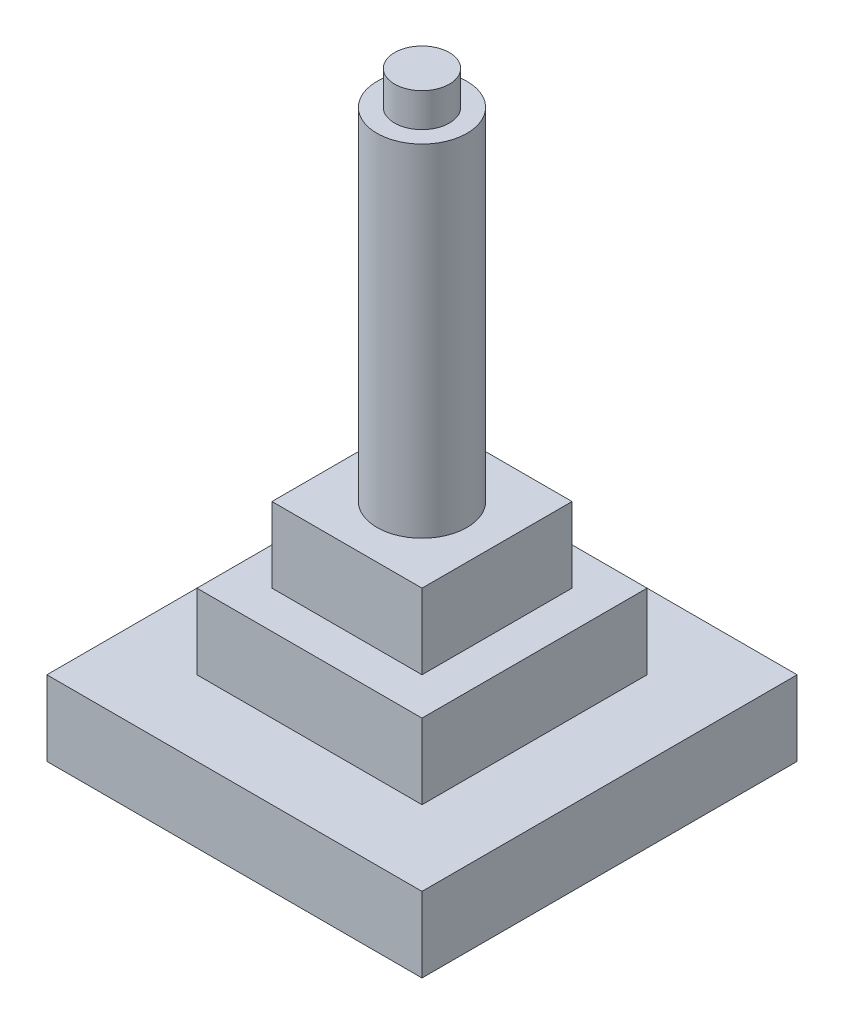
ISO-10303-21;
HEADER;
FILE_DESCRIPTION(('STEP AP214'),'2;1');
FILE_NAME('part.step','',(''),(''),'','','');
FILE_SCHEMA(('AUTOMOTIVE_DESIGN { 1 0 10303 214 1 1 1 1 }'));
ENDSEC;
DATA;
#1=APPLICATION_CONTEXT('core data for automotive mechanical design processes');
#2=APPLICATION_PROTOCOL_DEFINITION('international standard','automotive_design',2000,#1);
#3=PRODUCT_CONTEXT('',#1,'mechanical');
#4=PRODUCT('Part','Part','',(#3));
#5=PRODUCT_RELATED_PRODUCT_CATEGORY('part','',(#4));
#6=PRODUCT_DEFINITION_FORMATION('','',#4);
#7=PRODUCT_DEFINITION_CONTEXT('part definition',#1,'design');
#8=PRODUCT_DEFINITION('design','',#6,#7);
#9=PRODUCT_DEFINITION_SHAPE('','',#8);
#10=(LENGTH_UNIT() NAMED_UNIT(*) SI_UNIT(.MILLI.,.METRE.));
#11=(NAMED_UNIT(*) PLANE_ANGLE_UNIT() SI_UNIT($,.RADIAN.));
#12=(NAMED_UNIT(*) SI_UNIT($,.STERADIAN.) SOLID_ANGLE_UNIT());
#13=UNCERTAINTY_MEASURE_WITH_UNIT(LENGTH_MEASURE(1.E-05),#10,'distance_accuracy_value','');
#14=(GEOMETRIC_REPRESENTATION_CONTEXT(3) GLOBAL_UNCERTAINTY_ASSIGNED_CONTEXT((#13)) GLOBAL_UNIT_ASSIGNED_CONTEXT((#10,
#11,#12)) REPRESENTATION_CONTEXT('',''));
#15=CARTESIAN_POINT('',(0.,0.,0.));
#16=DIRECTION('',(0.,0.,1.));
#17=DIRECTION('',(1.,0.,0.));
#18=AXIS2_PLACEMENT_3D('',#15,#16,#17);
#19=CARTESIAN_POINT('',(0.,200.,0.));
#20=DIRECTION('',(0.,-1.,0.));
#21=DIRECTION('',(0.,0.,-1.));
#22=AXIS2_PLACEMENT_3D('',#19,#20,#21);
#23=PLANE('',#22);
#24=DIRECTION('',(0.,0.,-1.));
#25=VECTOR('',#24,1.);
#26=CARTESIAN_POINT('',(150.,200.,150.));
#27=LINE('',#26,#25);
#28=CARTESIAN_POINT('',(150.,200.,150.));
#29=VERTEX_POINT('',#28);
#30=CARTESIAN_POINT('',(150.,200.,-150.));
#31=VERTEX_POINT('',#30);
#32=EDGE_CURVE('E159',#29,#31,#27,.T.);
#33=ORIENTED_EDGE('',*,*,#32,.T.);
#34=DIRECTION('',(-1.,0.,0.));
#35=VECTOR('',#34,1.);
#36=CARTESIAN_POINT('',(-150.,200.,-150.));
#37=LINE('',#36,#35);
#38=CARTESIAN_POINT('',(-150.,200.,-150.));
#39=VERTEX_POINT('',#38);
#40=EDGE_CURVE('E162',#31,#39,#37,.T.);
#41=ORIENTED_EDGE('',*,*,#40,.T.);
#42=DIRECTION('',(0.,0.,1.));
#43=VECTOR('',#42,1.);
#44=CARTESIAN_POINT('',(-150.,200.,150.));
#45=LINE('',#44,#43);
#46=CARTESIAN_POINT('',(-150.,200.,150.));
#47=VERTEX_POINT('',#46);
#48=EDGE_CURVE('E165',#39,#47,#45,.T.);
#49=ORIENTED_EDGE('',*,*,#48,.T.);
#50=DIRECTION('',(1.,0.,0.));
#51=VECTOR('',#50,1.);
#52=CARTESIAN_POINT('',(-150.,200.,150.));
#53=LINE('',#52,#51);
#54=EDGE_CURVE('E167',#47,#29,#53,.T.);
#55=ORIENTED_EDGE('',*,*,#54,.T.);
#56=EDGE_LOOP('',(#33,#41,#49,#55));
#57=FACE_BOUND('',#56,.T.);
#58=DIRECTION('',(0.,0.,-1.));
#59=VECTOR('',#58,1.);
#60=CARTESIAN_POINT('',(100.,200.,100.));
#61=LINE('',#60,#59);
#62=CARTESIAN_POINT('',(100.,200.,100.));
#63=VERTEX_POINT('',#62);
#64=CARTESIAN_POINT('',(100.,200.,-100.));
#65=VERTEX_POINT('',#64);
#66=EDGE_CURVE('E56',#63,#65,#61,.T.);
#67=ORIENTED_EDGE('',*,*,#66,.F.);
#68=DIRECTION('',(1.,0.,0.));
#69=VECTOR('',#68,1.);
#70=CARTESIAN_POINT('',(-100.,200.,100.));
#71=LINE('',#70,#69);
#72=CARTESIAN_POINT('',(-100.,200.,100.));
#73=VERTEX_POINT('',#72);
#74=EDGE_CURVE('E60',#73,#63,#71,.T.);
#75=ORIENTED_EDGE('',*,*,#74,.F.);
#76=DIRECTION('',(0.,0.,1.));
#77=VECTOR('',#76,1.);
#78=CARTESIAN_POINT('',(-100.,200.,100.));
#79=LINE('',#78,#77);
#80=CARTESIAN_POINT('',(-100.,200.,-100.));
#81=VERTEX_POINT('',#80);
#82=EDGE_CURVE('E233',#81,#73,#79,.T.);
#83=ORIENTED_EDGE('',*,*,#82,.F.);
#84=DIRECTION('',(-1.,0.,0.));
#85=VECTOR('',#84,1.);
#86=CARTESIAN_POINT('',(-100.,200.,-100.));
#87=LINE('',#86,#85);
#88=EDGE_CURVE('E231',#65,#81,#87,.T.);
#89=ORIENTED_EDGE('',*,*,#88,.F.);
#90=EDGE_LOOP('',(#67,#75,#83,#89));
#91=FACE_BOUND('',#90,.T.);
#92=ADVANCED_FACE('F39',(#57,#91),#23,.F.);
#93=CARTESIAN_POINT('',(0.,100.,0.));
#94=DIRECTION('',(0.,-1.,0.));
#95=DIRECTION('',(0.,0.,-1.));
#96=AXIS2_PLACEMENT_3D('',#93,#94,#95);
#97=PLANE('',#96);
#98=DIRECTION('',(0.,0.,-1.));
#99=VECTOR('',#98,1.);
#100=CARTESIAN_POINT('',(250.,100.,250.));
#101=LINE('',#100,#99);
#102=CARTESIAN_POINT('',(250.,100.,250.));
#103=VERTEX_POINT('',#102);
#104=CARTESIAN_POINT('',(250.,100.,-250.));
#105=VERTEX_POINT('',#104);
#106=EDGE_CURVE('E189',#103,#105,#101,.T.);
#107=ORIENTED_EDGE('',*,*,#106,.T.);
#108=DIRECTION('',(-1.,0.,0.));
#109=VECTOR('',#108,1.);
#110=CARTESIAN_POINT('',(-250.,100.,-250.));
#111=LINE('',#110,#109);
#112=CARTESIAN_POINT('',(-250.,100.,-250.));
#113=VERTEX_POINT('',#112);
#114=EDGE_CURVE('E192',#105,#113,#111,.T.);
#115=ORIENTED_EDGE('',*,*,#114,.T.);
#116=DIRECTION('',(0.,0.,1.));
#117=VECTOR('',#116,1.);
#118=CARTESIAN_POINT('',(-250.,100.,250.));
#119=LINE('',#118,#117);
#120=CARTESIAN_POINT('',(-250.,100.,250.));
#121=VERTEX_POINT('',#120);
#122=EDGE_CURVE('E195',#113,#121,#119,.T.);
#123=ORIENTED_EDGE('',*,*,#122,.T.);
#124=DIRECTION('',(1.,0.,0.));
#125=VECTOR('',#124,1.);
#126=CARTESIAN_POINT('',(-250.,100.,250.));
#127=LINE('',#126,#125);
#128=EDGE_CURVE('E197',#121,#103,#127,.T.);
#129=ORIENTED_EDGE('',*,*,#128,.T.);
#130=EDGE_LOOP('',(#107,#115,#123,#129));
#131=FACE_BOUND('',#130,.T.);
#132=DIRECTION('',(0.,0.,-1.));
#133=VECTOR('',#132,1.);
#134=CARTESIAN_POINT('',(150.,100.,150.));
#135=LINE('',#134,#133);
#136=CARTESIAN_POINT('',(150.,100.,150.));
#137=VERTEX_POINT('',#136);
#138=CARTESIAN_POINT('',(150.,100.,-150.));
#139=VERTEX_POINT('',#138);
#140=EDGE_CURVE('E150',#137,#139,#135,.T.);
#141=ORIENTED_EDGE('',*,*,#140,.F.);
#142=DIRECTION('',(1.,0.,0.));
#143=VECTOR('',#142,1.);
#144=CARTESIAN_POINT('',(-150.,100.,150.));
#145=LINE('',#144,#143);
#146=CARTESIAN_POINT('',(-150.,100.,150.));
#147=VERTEX_POINT('',#146);
#148=EDGE_CURVE('E163',#147,#137,#145,.T.);
#149=ORIENTED_EDGE('',*,*,#148,.F.);
#150=DIRECTION('',(0.,0.,1.));
#151=VECTOR('',#150,1.);
#152=CARTESIAN_POINT('',(-150.,100.,150.));
#153=LINE('',#152,#151);
#154=CARTESIAN_POINT('',(-150.,100.,-150.));
#155=VERTEX_POINT('',#154);
#156=EDGE_CURVE('E172',#155,#147,#153,.T.);
#157=ORIENTED_EDGE('',*,*,#156,.F.);
#158=DIRECTION('',(-1.,0.,0.));
#159=VECTOR('',#158,1.);
#160=CARTESIAN_POINT('',(-150.,100.,-150.));
#161=LINE('',#160,#159);
#162=EDGE_CURVE('E153',#139,#155,#161,.T.);
#163=ORIENTED_EDGE('',*,*,#162,.F.);
#164=EDGE_LOOP('',(#141,#149,#157,#163));
#165=FACE_BOUND('',#164,.T.);
#166=ADVANCED_FACE('F243',(#131,#165),#97,.F.);
#167=CARTESIAN_POINT('',(250.,100.,250.));
#168=DIRECTION('',(-1.,0.,0.));
#169=DIRECTION('',(0.,0.,1.));
#170=AXIS2_PLACEMENT_3D('',#167,#168,#169);
#171=PLANE('',#170);
#172=DIRECTION('',(0.,0.,-1.));
#173=VECTOR('',#172,1.);
#174=CARTESIAN_POINT('',(250.,0.,250.));
#175=LINE('',#174,#173);
#176=CARTESIAN_POINT('',(250.,0.,250.));
#177=VERTEX_POINT('',#176);
#178=CARTESIAN_POINT('',(250.,0.,-250.));
#179=VERTEX_POINT('',#178);
#180=EDGE_CURVE('E188',#177,#179,#175,.T.);
#181=ORIENTED_EDGE('',*,*,#180,.T.);
#182=DIRECTION('',(0.,-1.,0.));
#183=VECTOR('',#182,1.);
#184=CARTESIAN_POINT('',(250.,100.,-250.));
#185=LINE('',#184,#183);
#186=EDGE_CURVE('E43',#105,#179,#185,.T.);
#187=ORIENTED_EDGE('',*,*,#186,.F.);
#188=ORIENTED_EDGE('',*,*,#106,.F.);
#189=DIRECTION('',(0.,-1.,0.));
#190=VECTOR('',#189,1.);
#191=CARTESIAN_POINT('',(250.,100.,250.));
#192=LINE('',#191,#190);
#193=EDGE_CURVE('E199',#103,#177,#192,.T.);
#194=ORIENTED_EDGE('',*,*,#193,.T.);
#195=EDGE_LOOP('',(#181,#187,#188,#194));
#196=FACE_BOUND('',#195,.T.);
#197=ADVANCED_FACE('F41',(#196),#171,.F.);
#198=CARTESIAN_POINT('',(-250.,100.,-250.));
#199=DIRECTION('',(0.,0.,1.));
#200=DIRECTION('',(1.,0.,0.));
#201=AXIS2_PLACEMENT_3D('',#198,#199,#200);
#202=PLANE('',#201);
#203=DIRECTION('',(-1.,0.,0.));
#204=VECTOR('',#203,1.);
#205=CARTESIAN_POINT('',(-250.,0.,-250.));
#206=LINE('',#205,#204);
#207=CARTESIAN_POINT('',(-250.,0.,-250.));
#208=VERTEX_POINT('',#207);
#209=EDGE_CURVE('E202',#179,#208,#206,.T.);
#210=ORIENTED_EDGE('',*,*,#209,.T.);
#211=DIRECTION('',(0.,-1.,0.));
#212=VECTOR('',#211,1.);
#213=CARTESIAN_POINT('',(-250.,100.,-250.));
#214=LINE('',#213,#212);
#215=EDGE_CURVE('E211',#113,#208,#214,.T.);
#216=ORIENTED_EDGE('',*,*,#215,.F.);
#217=ORIENTED_EDGE('',*,*,#114,.F.);
#218=ORIENTED_EDGE('',*,*,#186,.T.);
#219=EDGE_LOOP('',(#210,#216,#217,#218));
#220=FACE_BOUND('',#219,.T.);
#221=ADVANCED_FACE('F281',(#220),#202,.F.);
#222=CARTESIAN_POINT('',(-250.,100.,250.));
#223=DIRECTION('',(1.,0.,0.));
#224=DIRECTION('',(0.,0.,-1.));
#225=AXIS2_PLACEMENT_3D('',#222,#223,#224);
#226=PLANE('',#225);
#227=DIRECTION('',(0.,0.,1.));
#228=VECTOR('',#227,1.);
#229=CARTESIAN_POINT('',(-250.,0.,250.));
#230=LINE('',#229,#228);
#231=CARTESIAN_POINT('',(-250.,0.,250.));
#232=VERTEX_POINT('',#231);
#233=EDGE_CURVE('E204',#208,#232,#230,.T.);
#234=ORIENTED_EDGE('',*,*,#233,.T.);
#235=DIRECTION('',(0.,-1.,0.));
#236=VECTOR('',#235,1.);
#237=CARTESIAN_POINT('',(-250.,100.,250.));
#238=LINE('',#237,#236);
#239=EDGE_CURVE('E209',#121,#232,#238,.T.);
#240=ORIENTED_EDGE('',*,*,#239,.F.);
#241=ORIENTED_EDGE('',*,*,#122,.F.);
#242=ORIENTED_EDGE('',*,*,#215,.T.);
#243=EDGE_LOOP('',(#234,#240,#241,#242));
#244=FACE_BOUND('',#243,.T.);
#245=ADVANCED_FACE('F278',(#244),#226,.F.);
#246=CARTESIAN_POINT('',(-250.,100.,250.));
#247=DIRECTION('',(0.,0.,-1.));
#248=DIRECTION('',(-1.,0.,0.));
#249=AXIS2_PLACEMENT_3D('',#246,#247,#248);
#250=PLANE('',#249);
#251=DIRECTION('',(1.,0.,0.));
#252=VECTOR('',#251,1.);
#253=CARTESIAN_POINT('',(-250.,0.,250.));
#254=LINE('',#253,#252);
#255=EDGE_CURVE('E193',#232,#177,#254,.T.);
#256=ORIENTED_EDGE('',*,*,#255,.T.);
#257=ORIENTED_EDGE('',*,*,#193,.F.);
#258=ORIENTED_EDGE('',*,*,#128,.F.);
#259=ORIENTED_EDGE('',*,*,#239,.T.);
#260=EDGE_LOOP('',(#256,#257,#258,#259));
#261=FACE_BOUND('',#260,.T.);
#262=ADVANCED_FACE('F274',(#261),#250,.F.);
#263=CARTESIAN_POINT('',(0.,0.,0.));
#264=DIRECTION('',(0.,-1.,0.));
#265=DIRECTION('',(0.,0.,-1.));
#266=AXIS2_PLACEMENT_3D('',#263,#264,#265);
#267=PLANE('',#266);
#268=ORIENTED_EDGE('',*,*,#180,.F.);
#269=ORIENTED_EDGE('',*,*,#255,.F.);
#270=ORIENTED_EDGE('',*,*,#233,.F.);
#271=ORIENTED_EDGE('',*,*,#209,.F.);
#272=EDGE_LOOP('',(#268,#269,#270,#271));
#273=FACE_BOUND('',#272,.T.);
#274=ADVANCED_FACE('F269',(#273),#267,.T.);
#275=CARTESIAN_POINT('',(150.,200.,150.));
#276=DIRECTION('',(-1.,0.,0.));
#277=DIRECTION('',(0.,0.,1.));
#278=AXIS2_PLACEMENT_3D('',#275,#276,#277);
#279=PLANE('',#278);
#280=ORIENTED_EDGE('',*,*,#140,.T.);
#281=DIRECTION('',(0.,-1.,0.));
#282=VECTOR('',#281,1.);
#283=CARTESIAN_POINT('',(150.,200.,-150.));
#284=LINE('',#283,#282);
#285=EDGE_CURVE('E185',#31,#139,#284,.T.);
#286=ORIENTED_EDGE('',*,*,#285,.F.);
#287=ORIENTED_EDGE('',*,*,#32,.F.);
#288=DIRECTION('',(0.,-1.,0.));
#289=VECTOR('',#288,1.);
#290=CARTESIAN_POINT('',(150.,200.,150.));
#291=LINE('',#290,#289);
#292=EDGE_CURVE('E168',#29,#137,#291,.T.);
#293=ORIENTED_EDGE('',*,*,#292,.T.);
#294=EDGE_LOOP('',(#280,#286,#287,#293));
#295=FACE_BOUND('',#294,.T.);
#296=ADVANCED_FACE('F266',(#295),#279,.F.);
#297=CARTESIAN_POINT('',(-150.,200.,-150.));
#298=DIRECTION('',(0.,0.,1.));
#299=DIRECTION('',(1.,0.,0.));
#300=AXIS2_PLACEMENT_3D('',#297,#298,#299);
#301=PLANE('',#300);
#302=ORIENTED_EDGE('',*,*,#162,.T.);
#303=DIRECTION('',(0.,-1.,0.));
#304=VECTOR('',#303,1.);
#305=CARTESIAN_POINT('',(-150.,200.,-150.));
#306=LINE('',#305,#304);
#307=EDGE_CURVE('E182',#39,#155,#306,.T.);
#308=ORIENTED_EDGE('',*,*,#307,.F.);
#309=ORIENTED_EDGE('',*,*,#40,.F.);
#310=ORIENTED_EDGE('',*,*,#285,.T.);
#311=EDGE_LOOP('',(#302,#308,#309,#310));
#312=FACE_BOUND('',#311,.T.);
#313=ADVANCED_FACE('F262',(#312),#301,.F.);
#314=CARTESIAN_POINT('',(-150.,200.,150.));
#315=DIRECTION('',(1.,0.,0.));
#316=DIRECTION('',(0.,0.,-1.));
#317=AXIS2_PLACEMENT_3D('',#314,#315,#316);
#318=PLANE('',#317);
#319=ORIENTED_EDGE('',*,*,#156,.T.);
#320=DIRECTION('',(0.,-1.,0.));
#321=VECTOR('',#320,1.);
#322=CARTESIAN_POINT('',(-150.,200.,150.));
#323=LINE('',#322,#321);
#324=EDGE_CURVE('E179',#47,#147,#323,.T.);
#325=ORIENTED_EDGE('',*,*,#324,.F.);
#326=ORIENTED_EDGE('',*,*,#48,.F.);
#327=ORIENTED_EDGE('',*,*,#307,.T.);
#328=EDGE_LOOP('',(#319,#325,#326,#327));
#329=FACE_BOUND('',#328,.T.);
#330=ADVANCED_FACE('F258',(#329),#318,.F.);
#331=CARTESIAN_POINT('',(-150.,200.,150.));
#332=DIRECTION('',(0.,0.,-1.));
#333=DIRECTION('',(-1.,0.,0.));
#334=AXIS2_PLACEMENT_3D('',#331,#332,#333);
#335=PLANE('',#334);
#336=ORIENTED_EDGE('',*,*,#148,.T.);
#337=ORIENTED_EDGE('',*,*,#292,.F.);
#338=ORIENTED_EDGE('',*,*,#54,.F.);
#339=ORIENTED_EDGE('',*,*,#324,.T.);
#340=EDGE_LOOP('',(#336,#337,#338,#339));
#341=FACE_BOUND('',#340,.T.);
#342=ADVANCED_FACE('F256',(#341),#335,.F.);
#343=CARTESIAN_POINT('',(100.,300.,100.));
#344=DIRECTION('',(-1.,0.,0.));
#345=DIRECTION('',(0.,0.,1.));
#346=AXIS2_PLACEMENT_3D('',#343,#344,#345);
#347=PLANE('',#346);
#348=ORIENTED_EDGE('',*,*,#66,.T.);
#349=DIRECTION('',(0.,-1.,0.));
#350=VECTOR('',#349,1.);
#351=CARTESIAN_POINT('',(100.,300.,-100.));
#352=LINE('',#351,#350);
#353=CARTESIAN_POINT('',(100.,300.,-100.));
#354=VERTEX_POINT('',#353);
#355=EDGE_CURVE('E133',#354,#65,#352,.T.);
#356=ORIENTED_EDGE('',*,*,#355,.F.);
#357=DIRECTION('',(0.,0.,-1.));
#358=VECTOR('',#357,1.);
#359=CARTESIAN_POINT('',(100.,300.,100.));
#360=LINE('',#359,#358);
#361=CARTESIAN_POINT('',(100.,300.,100.));
#362=VERTEX_POINT('',#361);
#363=EDGE_CURVE('E139',#362,#354,#360,.T.);
#364=ORIENTED_EDGE('',*,*,#363,.F.);
#365=DIRECTION('',(0.,-1.,0.));
#366=VECTOR('',#365,1.);
#367=CARTESIAN_POINT('',(100.,300.,100.));
#368=LINE('',#367,#366);
#369=EDGE_CURVE('E229',#362,#63,#368,.T.);
#370=ORIENTED_EDGE('',*,*,#369,.T.);
#371=EDGE_LOOP('',(#348,#356,#364,#370));
#372=FACE_BOUND('',#371,.T.);
#373=ADVANCED_FACE('F149',(#372),#347,.F.);
#374=CARTESIAN_POINT('',(-100.,300.,-100.));
#375=DIRECTION('',(0.,0.,1.));
#376=DIRECTION('',(1.,0.,0.));
#377=AXIS2_PLACEMENT_3D('',#374,#375,#376);
#378=PLANE('',#377);
#379=ORIENTED_EDGE('',*,*,#88,.T.);
#380=DIRECTION('',(0.,-1.,0.));
#381=VECTOR('',#380,1.);
#382=CARTESIAN_POINT('',(-100.,300.,-100.));
#383=LINE('',#382,#381);
#384=CARTESIAN_POINT('',(-100.,300.,-100.));
#385=VERTEX_POINT('',#384);
#386=EDGE_CURVE('E135',#385,#81,#383,.T.);
#387=ORIENTED_EDGE('',*,*,#386,.F.);
#388=DIRECTION('',(-1.,0.,0.));
#389=VECTOR('',#388,1.);
#390=CARTESIAN_POINT('',(-100.,300.,-100.));
#391=LINE('',#390,#389);
#392=EDGE_CURVE('E128',#354,#385,#391,.T.);
#393=ORIENTED_EDGE('',*,*,#392,.F.);
#394=ORIENTED_EDGE('',*,*,#355,.T.);
#395=EDGE_LOOP('',(#379,#387,#393,#394));
#396=FACE_BOUND('',#395,.T.);
#397=ADVANCED_FACE('F131',(#396),#378,.F.);
#398=CARTESIAN_POINT('',(-100.,300.,100.));
#399=DIRECTION('',(1.,0.,0.));
#400=DIRECTION('',(0.,0.,-1.));
#401=AXIS2_PLACEMENT_3D('',#398,#399,#400);
#402=PLANE('',#401);
#403=ORIENTED_EDGE('',*,*,#82,.T.);
#404=DIRECTION('',(0.,-1.,0.));
#405=VECTOR('',#404,1.);
#406=CARTESIAN_POINT('',(-100.,300.,100.));
#407=LINE('',#406,#405);
#408=CARTESIAN_POINT('',(-100.,300.,100.));
#409=VERTEX_POINT('',#408);
#410=EDGE_CURVE('E155',#409,#73,#407,.T.);
#411=ORIENTED_EDGE('',*,*,#410,.F.);
#412=DIRECTION('',(0.,0.,1.));
#413=VECTOR('',#412,1.);
#414=CARTESIAN_POINT('',(-100.,300.,100.));
#415=LINE('',#414,#413);
#416=EDGE_CURVE('E138',#385,#409,#415,.T.);
#417=ORIENTED_EDGE('',*,*,#416,.F.);
#418=ORIENTED_EDGE('',*,*,#386,.T.);
#419=EDGE_LOOP('',(#403,#411,#417,#418));
#420=FACE_BOUND('',#419,.T.);
#421=ADVANCED_FACE('F241',(#420),#402,.F.);
#422=CARTESIAN_POINT('',(-100.,300.,100.));
#423=DIRECTION('',(0.,0.,-1.));
#424=DIRECTION('',(-1.,0.,0.));
#425=AXIS2_PLACEMENT_3D('',#422,#423,#424);
#426=PLANE('',#425);
#427=ORIENTED_EDGE('',*,*,#74,.T.);
#428=ORIENTED_EDGE('',*,*,#369,.F.);
#429=DIRECTION('',(1.,0.,0.));
#430=VECTOR('',#429,1.);
#431=CARTESIAN_POINT('',(-100.,300.,100.));
#432=LINE('',#431,#430);
#433=EDGE_CURVE('E144',#409,#362,#432,.T.);
#434=ORIENTED_EDGE('',*,*,#433,.F.);
#435=ORIENTED_EDGE('',*,*,#410,.T.);
#436=EDGE_LOOP('',(#427,#428,#434,#435));
#437=FACE_BOUND('',#436,.T.);
#438=ADVANCED_FACE('F239',(#437),#426,.F.);
#439=CARTESIAN_POINT('',(0.,300.,0.));
#440=DIRECTION('',(0.,-1.,0.));
#441=DIRECTION('',(0.,0.,-1.));
#442=AXIS2_PLACEMENT_3D('',#439,#440,#441);
#443=PLANE('',#442);
#444=CARTESIAN_POINT('',(0.,300.,0.));
#445=DIRECTION('',(0.,1.,0.));
#446=DIRECTION('',(0.,0.,1.));
#447=AXIS2_PLACEMENT_3D('',#444,#445,#446);
#448=CIRCLE('',#447,60.);
#449=CARTESIAN_POINT('',(0.,300.,-60.));
#450=VERTEX_POINT('',#449);
#451=EDGE_CURVE('E48',#450,#450,#448,.T.);
#452=ORIENTED_EDGE('',*,*,#451,.F.);
#453=EDGE_LOOP('',(#452));
#454=FACE_BOUND('',#453,.T.);
#455=ORIENTED_EDGE('',*,*,#363,.T.);
#456=ORIENTED_EDGE('',*,*,#392,.T.);
#457=ORIENTED_EDGE('',*,*,#416,.T.);
#458=ORIENTED_EDGE('',*,*,#433,.T.);
#459=EDGE_LOOP('',(#455,#456,#457,#458));
#460=FACE_BOUND('',#459,.T.);
#461=ADVANCED_FACE('F142',(#454,#460),#443,.F.);
#462=CARTESIAN_POINT('',(0.,755.,0.));
#463=DIRECTION('',(0.,-1.,0.));
#464=DIRECTION('',(0.,0.,-1.));
#465=AXIS2_PLACEMENT_3D('',#462,#463,#464);
#466=CYLINDRICAL_SURFACE('',#465,60.);
#467=CARTESIAN_POINT('',(0.,755.,0.));
#468=DIRECTION('',(0.,1.,0.));
#469=DIRECTION('',(0.,0.,1.));
#470=AXIS2_PLACEMENT_3D('',#467,#468,#469);
#471=CIRCLE('',#470,60.);
#472=CARTESIAN_POINT('',(0.,755.,-60.));
#473=VERTEX_POINT('',#472);
#474=EDGE_CURVE('E225',#473,#473,#471,.T.);
#475=CARTESIAN_POINT('',(0.,755.,-60.));
#476=CARTESIAN_POINT('',(0.,750.260416666667,-60.));
#477=CARTESIAN_POINT('',(0.,745.520833333333,-60.));
#478=CARTESIAN_POINT('',(0.,736.041666666667,-60.));
#479=CARTESIAN_POINT('',(0.,731.302083333333,-60.));
#480=CARTESIAN_POINT('',(0.,721.822916666667,-60.));
#481=CARTESIAN_POINT('',(0.,717.083333333333,-60.));
#482=CARTESIAN_POINT('',(0.,707.604166666667,-60.));
#483=CARTESIAN_POINT('',(0.,702.864583333333,-60.));
#484=CARTESIAN_POINT('',(0.,693.385416666667,-60.));
#485=CARTESIAN_POINT('',(0.,688.645833333333,-60.));
#486=CARTESIAN_POINT('',(0.,679.166666666667,-60.));
#487=CARTESIAN_POINT('',(0.,674.427083333333,-60.));
#488=CARTESIAN_POINT('',(0.,664.947916666667,-60.));
#489=CARTESIAN_POINT('',(0.,660.208333333333,-60.));
#490=CARTESIAN_POINT('',(0.,650.729166666667,-60.));
#491=CARTESIAN_POINT('',(0.,645.989583333333,-60.));
#492=CARTESIAN_POINT('',(0.,636.510416666667,-60.));
#493=CARTESIAN_POINT('',(0.,631.770833333333,-60.));
#494=CARTESIAN_POINT('',(0.,622.291666666667,-60.));
#495=CARTESIAN_POINT('',(0.,617.552083333333,-60.));
#496=CARTESIAN_POINT('',(0.,608.072916666667,-60.));
#497=CARTESIAN_POINT('',(0.,603.333333333333,-60.));
#498=CARTESIAN_POINT('',(0.,593.854166666667,-60.));
#499=CARTESIAN_POINT('',(0.,589.114583333333,-60.));
#500=CARTESIAN_POINT('',(0.,579.635416666667,-60.));
#501=CARTESIAN_POINT('',(0.,574.895833333333,-60.));
#502=CARTESIAN_POINT('',(0.,565.416666666667,-60.));
#503=CARTESIAN_POINT('',(0.,560.677083333333,-60.));
#504=CARTESIAN_POINT('',(0.,551.197916666667,-60.));
#505=CARTESIAN_POINT('',(0.,546.458333333333,-60.));
#506=CARTESIAN_POINT('',(0.,536.979166666667,-60.));
#507=CARTESIAN_POINT('',(0.,532.239583333333,-60.));
#508=CARTESIAN_POINT('',(0.,522.760416666667,-60.));
#509=CARTESIAN_POINT('',(0.,518.020833333333,-60.));
#510=CARTESIAN_POINT('',(0.,508.541666666667,-60.));
#511=CARTESIAN_POINT('',(0.,503.802083333333,-60.));
#512=CARTESIAN_POINT('',(0.,494.322916666667,-60.));
#513=CARTESIAN_POINT('',(0.,489.583333333333,-60.));
#514=CARTESIAN_POINT('',(0.,480.104166666667,-60.));
#515=CARTESIAN_POINT('',(0.,475.364583333333,-60.));
#516=CARTESIAN_POINT('',(0.,465.885416666667,-60.));
#517=CARTESIAN_POINT('',(0.,461.145833333333,-60.));
#518=CARTESIAN_POINT('',(0.,451.666666666667,-60.));
#519=CARTESIAN_POINT('',(0.,446.927083333333,-60.));
#520=CARTESIAN_POINT('',(0.,437.447916666667,-60.));
#521=CARTESIAN_POINT('',(0.,432.708333333333,-60.));
#522=CARTESIAN_POINT('',(0.,423.229166666667,-60.));
#523=CARTESIAN_POINT('',(0.,418.489583333333,-60.));
#524=CARTESIAN_POINT('',(0.,409.010416666667,-60.));
#525=CARTESIAN_POINT('',(0.,404.270833333333,-60.));
#526=CARTESIAN_POINT('',(0.,394.791666666667,-60.));
#527=CARTESIAN_POINT('',(0.,390.052083333333,-60.));
#528=CARTESIAN_POINT('',(0.,380.572916666667,-60.));
#529=CARTESIAN_POINT('',(0.,375.833333333333,-60.));
#530=CARTESIAN_POINT('',(0.,366.354166666667,-60.));
#531=CARTESIAN_POINT('',(0.,361.614583333333,-60.));
#532=CARTESIAN_POINT('',(0.,352.135416666667,-60.));
#533=CARTESIAN_POINT('',(0.,347.395833333333,-60.));
#534=CARTESIAN_POINT('',(0.,337.916666666667,-60.));
#535=CARTESIAN_POINT('',(0.,333.177083333333,-60.));
#536=CARTESIAN_POINT('',(0.,323.697916666667,-60.));
#537=CARTESIAN_POINT('',(0.,318.958333333333,-60.));
#538=CARTESIAN_POINT('',(0.,309.479166666667,-60.));
#539=CARTESIAN_POINT('',(0.,304.739583333333,-60.));
#540=CARTESIAN_POINT('',(0.,300.,-60.));
#541=B_SPLINE_CURVE_WITH_KNOTS('',3,(#475,#476,#477,#478,#479,#480,#481,#482,#483,#484,#485,
#486,#487,#488,#489,#490,#491,#492,#493,#494,#495,#496,#497,#498,#499,#500,#501,#502,#503,#504,
#505,#506,#507,#508,#509,#510,#511,#512,#513,#514,#515,#516,#517,#518,#519,#520,#521,#522,#523,
#524,#525,#526,#527,#528,#529,#530,#531,#532,#533,#534,#535,#536,#537,#538,#539,#540),
.UNSPECIFIED.,.F.,.F.,(4,2,2,2,2,2,2,2,2,2,2,2,2,2,2,2,2,2,2,2,2,2,2,2,2,2,2,2,2,2,2,2,4),(0.,
14.2187499999999,28.4375,42.65625,56.8749999999999,71.09375,85.3125,99.53125,113.75,127.96875,
142.1875,156.40625,170.625,184.84375,199.0625,213.28125,227.5,241.71875,255.9375,270.15625,
284.375,298.59375,312.8125,327.03125,341.25,355.46875,369.6875,383.90625,398.125,412.34375,
426.5625,440.78125,455.),.UNSPECIFIED.);
#542=EDGE_CURVE('BSEAM397',#473,#450,#541,.T.);
#543=ORIENTED_EDGE('',*,*,#474,.F.);
#544=ORIENTED_EDGE('',*,*,#451,.T.);
#545=ORIENTED_EDGE('',*,*,#542,.T.);
#546=ORIENTED_EDGE('',*,*,#542,.F.);
#547=EDGE_LOOP('',(#543,#545,#544,#546));
#548=FACE_BOUND('',#547,.T.);
#549=ADVANCED_FACE('F397',(#548),#466,.T.);
#550=CARTESIAN_POINT('',(0.,755.,0.));
#551=DIRECTION('',(0.,1.,0.));
#552=DIRECTION('',(0.,0.,1.));
#553=AXIS2_PLACEMENT_3D('',#550,#551,#552);
#554=PLANE('',#553);
#555=CARTESIAN_POINT('',(0.,755.,0.));
#556=DIRECTION('',(0.,1.,0.));
#557=DIRECTION('',(0.,0.,1.));
#558=AXIS2_PLACEMENT_3D('',#555,#556,#557);
#559=CIRCLE('',#558,36.5);
#560=CARTESIAN_POINT('',(0.,755.,-36.5));
#561=VERTEX_POINT('',#560);
#562=EDGE_CURVE('E11',#561,#561,#559,.T.);
#563=ORIENTED_EDGE('',*,*,#562,.F.);
#564=EDGE_LOOP('',(#563));
#565=FACE_BOUND('',#564,.T.);
#566=ORIENTED_EDGE('',*,*,#474,.T.);
#567=EDGE_LOOP('',(#566));
#568=FACE_BOUND('',#567,.T.);
#569=ADVANCED_FACE('F407',(#565,#568),#554,.T.);
#570=CARTESIAN_POINT('',(0.,800.,0.));
#571=DIRECTION('',(0.,-1.,0.));
#572=DIRECTION('',(0.,0.,-1.));
#573=AXIS2_PLACEMENT_3D('',#570,#571,#572);
#574=CYLINDRICAL_SURFACE('',#573,36.5);
#575=CARTESIAN_POINT('',(0.,800.,0.));
#576=DIRECTION('',(0.,1.,0.));
#577=DIRECTION('',(0.,0.,1.));
#578=AXIS2_PLACEMENT_3D('',#575,#576,#577);
#579=CIRCLE('',#578,36.5);
#580=CARTESIAN_POINT('',(0.,800.,-36.5));
#581=VERTEX_POINT('',#580);
#582=EDGE_CURVE('E442',#581,#581,#579,.T.);
#583=CARTESIAN_POINT('',(0.,800.,-36.5));
#584=CARTESIAN_POINT('',(0.,799.53125,-36.5));
#585=CARTESIAN_POINT('',(0.,799.0625,-36.5));
#586=CARTESIAN_POINT('',(0.,798.125,-36.5));
#587=CARTESIAN_POINT('',(0.,797.65625,-36.5));
#588=CARTESIAN_POINT('',(0.,796.71875,-36.5));
#589=CARTESIAN_POINT('',(0.,796.25,-36.5));
#590=CARTESIAN_POINT('',(0.,795.3125,-36.5));
#591=CARTESIAN_POINT('',(0.,794.84375,-36.5));
#592=CARTESIAN_POINT('',(0.,793.90625,-36.5));
#593=CARTESIAN_POINT('',(0.,793.4375,-36.5));
#594=CARTESIAN_POINT('',(0.,792.5,-36.5));
#595=CARTESIAN_POINT('',(0.,792.03125,-36.5));
#596=CARTESIAN_POINT('',(0.,791.09375,-36.5));
#597=CARTESIAN_POINT('',(0.,790.625,-36.5));
#598=CARTESIAN_POINT('',(0.,789.6875,-36.5));
#599=CARTESIAN_POINT('',(0.,789.21875,-36.5));
#600=CARTESIAN_POINT('',(0.,788.28125,-36.5));
#601=CARTESIAN_POINT('',(0.,787.8125,-36.5));
#602=CARTESIAN_POINT('',(0.,786.875,-36.5));
#603=CARTESIAN_POINT('',(0.,786.40625,-36.5));
#604=CARTESIAN_POINT('',(0.,785.46875,-36.5));
#605=CARTESIAN_POINT('',(0.,785.,-36.5));
#606=CARTESIAN_POINT('',(0.,784.0625,-36.5));
#607=CARTESIAN_POINT('',(0.,783.59375,-36.5));
#608=CARTESIAN_POINT('',(0.,782.65625,-36.5));
#609=CARTESIAN_POINT('',(0.,782.1875,-36.5));
#610=CARTESIAN_POINT('',(0.,781.25,-36.5));
#611=CARTESIAN_POINT('',(0.,780.78125,-36.5));
#612=CARTESIAN_POINT('',(0.,779.84375,-36.5));
#613=CARTESIAN_POINT('',(0.,779.375,-36.5));
#614=CARTESIAN_POINT('',(0.,778.4375,-36.5));
#615=CARTESIAN_POINT('',(0.,777.96875,-36.5));
#616=CARTESIAN_POINT('',(0.,777.03125,-36.5));
#617=CARTESIAN_POINT('',(0.,776.5625,-36.5));
#618=CARTESIAN_POINT('',(0.,775.625,-36.5));
#619=CARTESIAN_POINT('',(0.,775.15625,-36.5));
#620=CARTESIAN_POINT('',(0.,774.21875,-36.5));
#621=CARTESIAN_POINT('',(0.,773.75,-36.5));
#622=CARTESIAN_POINT('',(0.,772.8125,-36.5));
#623=CARTESIAN_POINT('',(0.,772.34375,-36.5));
#624=CARTESIAN_POINT('',(0.,771.40625,-36.5));
#625=CARTESIAN_POINT('',(0.,770.9375,-36.5));
#626=CARTESIAN_POINT('',(0.,770.,-36.5));
#627=CARTESIAN_POINT('',(0.,769.53125,-36.5));
#628=CARTESIAN_POINT('',(0.,768.59375,-36.5));
#629=CARTESIAN_POINT('',(0.,768.125,-36.5));
#630=CARTESIAN_POINT('',(0.,767.1875,-36.5));
#631=CARTESIAN_POINT('',(0.,766.71875,-36.5));
#632=CARTESIAN_POINT('',(0.,765.78125,-36.5));
#633=CARTESIAN_POINT('',(0.,765.3125,-36.5));
#634=CARTESIAN_POINT('',(0.,764.375,-36.5));
#635=CARTESIAN_POINT('',(0.,763.90625,-36.5));
#636=CARTESIAN_POINT('',(0.,762.96875,-36.5));
#637=CARTESIAN_POINT('',(0.,762.5,-36.5));
#638=CARTESIAN_POINT('',(0.,761.5625,-36.5));
#639=CARTESIAN_POINT('',(0.,761.09375,-36.5));
#640=CARTESIAN_POINT('',(0.,760.15625,-36.5));
#641=CARTESIAN_POINT('',(0.,759.6875,-36.5));
#642=CARTESIAN_POINT('',(0.,758.75,-36.5));
#643=CARTESIAN_POINT('',(0.,758.28125,-36.5));
#644=CARTESIAN_POINT('',(0.,757.34375,-36.5));
#645=CARTESIAN_POINT('',(0.,756.875,-36.5));
#646=CARTESIAN_POINT('',(0.,755.9375,-36.5));
#647=CARTESIAN_POINT('',(0.,755.46875,-36.5));
#648=CARTESIAN_POINT('',(0.,755.,-36.5));
#649=B_SPLINE_CURVE_WITH_KNOTS('',3,(#583,#584,#585,#586,#587,#588,#589,#590,#591,#592,#593,
#594,#595,#596,#597,#598,#599,#600,#601,#602,#603,#604,#605,#606,#607,#608,#609,#610,#611,#612,
#613,#614,#615,#616,#617,#618,#619,#620,#621,#622,#623,#624,#625,#626,#627,#628,#629,#630,#631,
#632,#633,#634,#635,#636,#637,#638,#639,#640,#641,#642,#643,#644,#645,#646,#647,#648),
.UNSPECIFIED.,.F.,.F.,(4,2,2,2,2,2,2,2,2,2,2,2,2,2,2,2,2,2,2,2,2,2,2,2,2,2,2,2,2,2,2,2,4),(0.,
1.40625000000005,2.81250000000011,4.21875000000005,5.6250000000001,7.03125000000004,
8.4375000000001,9.84375000000004,11.2500000000001,12.65625,14.0625000000001,15.46875,
16.8750000000001,18.28125,19.6875000000001,21.09375,22.5000000000001,23.9062500000001,
25.3125000000001,26.7187500000001,28.1250000000001,29.5312500000001,30.9375000000001,
32.3437500000001,33.7500000000001,35.1562500000001,36.5625000000001,37.9687500000001,39.375,
40.7812500000001,42.1875000000002,43.5937500000001,45.0000000000001),.UNSPECIFIED.);
#650=EDGE_CURVE('BSEAM417',#581,#561,#649,.T.);
#651=ORIENTED_EDGE('',*,*,#582,.F.);
#652=ORIENTED_EDGE('',*,*,#562,.T.);
#653=ORIENTED_EDGE('',*,*,#650,.T.);
#654=ORIENTED_EDGE('',*,*,#650,.F.);
#655=EDGE_LOOP('',(#651,#653,#652,#654));
#656=FACE_BOUND('',#655,.T.);
#657=ADVANCED_FACE('F417',(#656),#574,.T.);
#658=CARTESIAN_POINT('',(0.,800.,0.));
#659=DIRECTION('',(0.,1.,0.));
#660=DIRECTION('',(0.,0.,1.));
#661=AXIS2_PLACEMENT_3D('',#658,#659,#660);
#662=PLANE('',#661);
#663=ORIENTED_EDGE('',*,*,#582,.T.);
#664=EDGE_LOOP('',(#663));
#665=FACE_BOUND('',#664,.T.);
#666=ADVANCED_FACE('F427',(#665),#662,.T.);
#667=CLOSED_SHELL('',(#92,#166,#197,#221,#245,#262,#274,#296,#313,#330,#342,#373,#397,#421,#438,
#461,#549,#569,#657,#666));
#668=MANIFOLD_SOLID_BREP('B2',#667);
#669=ADVANCED_BREP_SHAPE_REPRESENTATION('',(#18,#668),#14);
#670=SHAPE_DEFINITION_REPRESENTATION(#9,#669);
ENDSEC;
END-ISO-10303-21;
